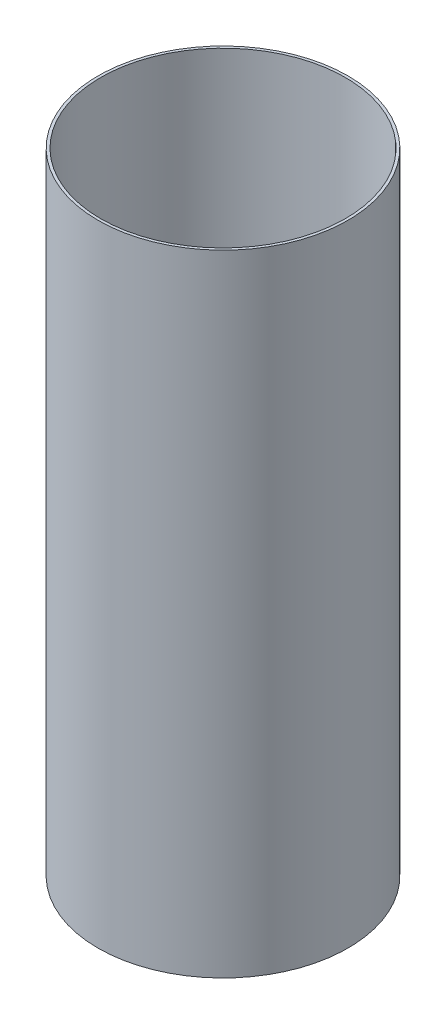
ISO-10303-21;
HEADER;
FILE_DESCRIPTION(('STEP AP214'),'2;1');
FILE_NAME('part.step','',(''),(''),'','','');
FILE_SCHEMA(('AUTOMOTIVE_DESIGN { 1 0 10303 214 1 1 1 1 }'));
ENDSEC;
DATA;
#1=APPLICATION_CONTEXT('core data for automotive mechanical design processes');
#2=APPLICATION_PROTOCOL_DEFINITION('international standard','automotive_design',2000,#1);
#3=PRODUCT_CONTEXT('',#1,'mechanical');
#4=PRODUCT('Part','Part','',(#3));
#5=PRODUCT_RELATED_PRODUCT_CATEGORY('part','',(#4));
#6=PRODUCT_DEFINITION_FORMATION('','',#4);
#7=PRODUCT_DEFINITION_CONTEXT('part definition',#1,'design');
#8=PRODUCT_DEFINITION('design','',#6,#7);
#9=PRODUCT_DEFINITION_SHAPE('','',#8);
#10=(LENGTH_UNIT() NAMED_UNIT(*) SI_UNIT(.MILLI.,.METRE.));
#11=(NAMED_UNIT(*) PLANE_ANGLE_UNIT() SI_UNIT($,.RADIAN.));
#12=(NAMED_UNIT(*) SI_UNIT($,.STERADIAN.) SOLID_ANGLE_UNIT());
#13=UNCERTAINTY_MEASURE_WITH_UNIT(LENGTH_MEASURE(1.E-05),#10,'distance_accuracy_value','');
#14=(GEOMETRIC_REPRESENTATION_CONTEXT(3) GLOBAL_UNCERTAINTY_ASSIGNED_CONTEXT((#13)) GLOBAL_UNIT_ASSIGNED_CONTEXT((#10,
#11,#12)) REPRESENTATION_CONTEXT('',''));
#15=CARTESIAN_POINT('',(0.,0.,0.));
#16=DIRECTION('',(0.,0.,1.));
#17=DIRECTION('',(1.,0.,0.));
#18=AXIS2_PLACEMENT_3D('',#15,#16,#17);
#19=CARTESIAN_POINT('',(0.,393.7,0.));
#20=DIRECTION('',(0.,1.,0.));
#21=DIRECTION('',(0.,0.,1.));
#22=AXIS2_PLACEMENT_3D('',#19,#20,#21);
#23=PLANE('',#22);
#24=CARTESIAN_POINT('',(0.,393.7,0.));
#25=DIRECTION('',(0.,1.,0.));
#26=DIRECTION('',(0.,0.,1.));
#27=AXIS2_PLACEMENT_3D('',#24,#25,#26);
#28=CIRCLE('',#27,78.105);
#29=CARTESIAN_POINT('',(0.,393.7,78.105));
#30=VERTEX_POINT('',#29);
#31=EDGE_CURVE('E10',#30,#30,#28,.T.);
#32=ORIENTED_EDGE('',*,*,#31,.T.);
#33=EDGE_LOOP('',(#32));
#34=FACE_BOUND('',#33,.T.);
#35=CARTESIAN_POINT('',(0.,393.7,0.));
#36=DIRECTION('',(0.,1.,0.));
#37=DIRECTION('',(0.,0.,1.));
#38=AXIS2_PLACEMENT_3D('',#35,#36,#37);
#39=CIRCLE('',#38,76.4286);
#40=CARTESIAN_POINT('',(0.,393.7,76.4286));
#41=VERTEX_POINT('',#40);
#42=EDGE_CURVE('E54',#41,#41,#39,.T.);
#43=ORIENTED_EDGE('',*,*,#42,.F.);
#44=EDGE_LOOP('',(#43));
#45=FACE_BOUND('',#44,.T.);
#46=ADVANCED_FACE('F40',(#34,#45),#23,.T.);
#47=CARTESIAN_POINT('',(0.,0.,0.));
#48=DIRECTION('',(0.,1.,0.));
#49=DIRECTION('',(0.,0.,1.));
#50=AXIS2_PLACEMENT_3D('',#47,#48,#49);
#51=PLANE('',#50);
#52=CARTESIAN_POINT('',(0.,0.,0.));
#53=DIRECTION('',(0.,1.,0.));
#54=DIRECTION('',(0.,0.,1.));
#55=AXIS2_PLACEMENT_3D('',#52,#53,#54);
#56=CIRCLE('',#55,78.105);
#57=CARTESIAN_POINT('',(0.,0.,78.105));
#58=VERTEX_POINT('',#57);
#59=EDGE_CURVE('E44',#58,#58,#56,.T.);
#60=ORIENTED_EDGE('',*,*,#59,.F.);
#61=EDGE_LOOP('',(#60));
#62=FACE_BOUND('',#61,.T.);
#63=CARTESIAN_POINT('',(0.,0.,0.));
#64=DIRECTION('',(0.,1.,0.));
#65=DIRECTION('',(0.,0.,1.));
#66=AXIS2_PLACEMENT_3D('',#63,#64,#65);
#67=CIRCLE('',#66,76.4286);
#68=CARTESIAN_POINT('',(0.,0.,76.4286));
#69=VERTEX_POINT('',#68);
#70=EDGE_CURVE('E56',#69,#69,#67,.T.);
#71=ORIENTED_EDGE('',*,*,#70,.T.);
#72=EDGE_LOOP('',(#71));
#73=FACE_BOUND('',#72,.T.);
#74=ADVANCED_FACE('F67',(#62,#73),#51,.F.);
#75=CARTESIAN_POINT('',(0.,393.7,0.));
#76=DIRECTION('',(0.,-1.,0.));
#77=DIRECTION('',(0.,0.,-1.));
#78=AXIS2_PLACEMENT_3D('',#75,#76,#77);
#79=CYLINDRICAL_SURFACE('',#78,78.105);
#80=ORIENTED_EDGE('',*,*,#31,.F.);
#81=EDGE_LOOP('',(#80));
#82=FACE_BOUND('',#81,.T.);
#83=ORIENTED_EDGE('',*,*,#59,.T.);
#84=EDGE_LOOP('',(#83));
#85=FACE_BOUND('',#84,.T.);
#86=ADVANCED_FACE('F42',(#82,#85),#79,.T.);
#87=CARTESIAN_POINT('',(0.,393.7,0.));
#88=DIRECTION('',(0.,-1.,0.));
#89=DIRECTION('',(0.,0.,-1.));
#90=AXIS2_PLACEMENT_3D('',#87,#88,#89);
#91=CYLINDRICAL_SURFACE('',#90,76.4286);
#92=ORIENTED_EDGE('',*,*,#42,.T.);
#93=EDGE_LOOP('',(#92));
#94=FACE_BOUND('',#93,.T.);
#95=ORIENTED_EDGE('',*,*,#70,.F.);
#96=EDGE_LOOP('',(#95));
#97=FACE_BOUND('',#96,.T.);
#98=ADVANCED_FACE('F63',(#94,#97),#91,.F.);
#99=CLOSED_SHELL('',(#46,#74,#86,#98));
#100=MANIFOLD_SOLID_BREP('B2',#99);
#101=ADVANCED_BREP_SHAPE_REPRESENTATION('',(#18,#100),#14);
#102=SHAPE_DEFINITION_REPRESENTATION(#9,#101);
ENDSEC;
END-ISO-10303-21;
